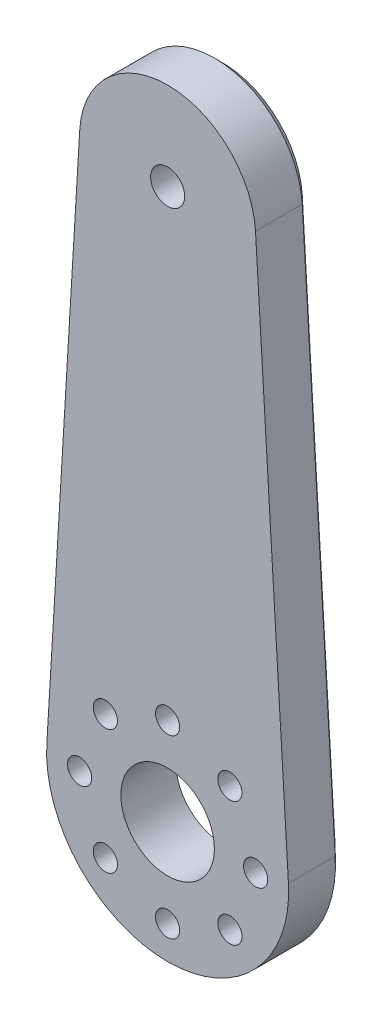
ISO-10303-21;
HEADER;
FILE_DESCRIPTION(('STEP AP214'),'2;1');
FILE_NAME('part.step','',(''),(''),'','','');
FILE_SCHEMA(('AUTOMOTIVE_DESIGN { 1 0 10303 214 1 1 1 1 }'));
ENDSEC;
DATA;
#1=APPLICATION_CONTEXT('core data for automotive mechanical design processes');
#2=APPLICATION_PROTOCOL_DEFINITION('international standard','automotive_design',2000,#1);
#3=PRODUCT_CONTEXT('',#1,'mechanical');
#4=PRODUCT('Part','Part','',(#3));
#5=PRODUCT_RELATED_PRODUCT_CATEGORY('part','',(#4));
#6=PRODUCT_DEFINITION_FORMATION('','',#4);
#7=PRODUCT_DEFINITION_CONTEXT('part definition',#1,'design');
#8=PRODUCT_DEFINITION('design','',#6,#7);
#9=PRODUCT_DEFINITION_SHAPE('','',#8);
#10=(LENGTH_UNIT() NAMED_UNIT(*) SI_UNIT(.MILLI.,.METRE.));
#11=(NAMED_UNIT(*) PLANE_ANGLE_UNIT() SI_UNIT($,.RADIAN.));
#12=(NAMED_UNIT(*) SI_UNIT($,.STERADIAN.) SOLID_ANGLE_UNIT());
#13=UNCERTAINTY_MEASURE_WITH_UNIT(LENGTH_MEASURE(1.E-05),#10,'distance_accuracy_value','');
#14=(GEOMETRIC_REPRESENTATION_CONTEXT(3) GLOBAL_UNCERTAINTY_ASSIGNED_CONTEXT((#13)) GLOBAL_UNIT_ASSIGNED_CONTEXT((#10,
#11,#12)) REPRESENTATION_CONTEXT('',''));
#15=CARTESIAN_POINT('',(0.,0.,0.));
#16=DIRECTION('',(0.,0.,1.));
#17=DIRECTION('',(1.,0.,0.));
#18=AXIS2_PLACEMENT_3D('',#15,#16,#17);
#19=CARTESIAN_POINT('',(-7.13829342442066,-19.0839036018759,5.));
#20=DIRECTION('',(0.,0.,-1.));
#21=DIRECTION('',(-1.,0.,0.));
#22=AXIS2_PLACEMENT_3D('',#19,#20,#21);
#23=CYLINDRICAL_SURFACE('',#22,1.1);
#24=CARTESIAN_POINT('',(-7.13829342442066,-19.0839036018759,5.));
#25=DIRECTION('',(0.,0.,1.));
#26=DIRECTION('',(1.,0.,0.));
#27=AXIS2_PLACEMENT_3D('',#24,#25,#26);
#28=CIRCLE('',#27,1.1);
#29=CARTESIAN_POINT('',(-6.03829342442066,-19.0839036018759,5.));
#30=VERTEX_POINT('',#29);
#31=EDGE_CURVE('E181',#30,#30,#28,.T.);
#32=ORIENTED_EDGE('',*,*,#31,.T.);
#33=EDGE_LOOP('',(#32));
#34=FACE_BOUND('',#33,.T.);
#35=CARTESIAN_POINT('',(-7.13829342442066,-19.0839036018759,2.25));
#36=DIRECTION('',(0.,0.,-1.));
#37=DIRECTION('',(-1.,0.,0.));
#38=AXIS2_PLACEMENT_3D('',#35,#36,#37);
#39=CIRCLE('',#38,1.1);
#40=CARTESIAN_POINT('',(-8.23829342442066,-19.0839036018759,2.25));
#41=VERTEX_POINT('',#40);
#42=EDGE_CURVE('E234',#41,#41,#39,.T.);
#43=ORIENTED_EDGE('',*,*,#42,.T.);
#44=EDGE_LOOP('',(#43));
#45=FACE_BOUND('',#44,.T.);
#46=ADVANCED_FACE('F35',(#34,#45),#23,.F.);
#47=CARTESIAN_POINT('',(-9.48143917492827,-24.7407578513683,5.));
#48=DIRECTION('',(0.,0.,-1.));
#49=DIRECTION('',(-1.,0.,0.));
#50=AXIS2_PLACEMENT_3D('',#47,#48,#49);
#51=CYLINDRICAL_SURFACE('',#50,1.1);
#52=CARTESIAN_POINT('',(-9.48143917492827,-24.7407578513683,5.));
#53=DIRECTION('',(0.,0.,1.));
#54=DIRECTION('',(1.,0.,0.));
#55=AXIS2_PLACEMENT_3D('',#52,#53,#54);
#56=CIRCLE('',#55,1.1);
#57=CARTESIAN_POINT('',(-8.38143917492827,-24.7407578513683,5.));
#58=VERTEX_POINT('',#57);
#59=EDGE_CURVE('E178',#58,#58,#56,.T.);
#60=ORIENTED_EDGE('',*,*,#59,.T.);
#61=EDGE_LOOP('',(#60));
#62=FACE_BOUND('',#61,.T.);
#63=CARTESIAN_POINT('',(-9.48143917492827,-24.7407578513683,2.25));
#64=DIRECTION('',(0.,0.,-1.));
#65=DIRECTION('',(-1.,0.,0.));
#66=AXIS2_PLACEMENT_3D('',#63,#64,#65);
#67=CIRCLE('',#66,1.1);
#68=CARTESIAN_POINT('',(-10.5814391749283,-24.7407578513683,2.25));
#69=VERTEX_POINT('',#68);
#70=EDGE_CURVE('E231',#69,#69,#67,.T.);
#71=ORIENTED_EDGE('',*,*,#70,.T.);
#72=EDGE_LOOP('',(#71));
#73=FACE_BOUND('',#72,.T.);
#74=ADVANCED_FACE('F332',(#62,#73),#51,.F.);
#75=CARTESIAN_POINT('',(-15.1382934244207,-27.0839036018759,5.));
#76=DIRECTION('',(0.,0.,-1.));
#77=DIRECTION('',(-1.,0.,0.));
#78=AXIS2_PLACEMENT_3D('',#75,#76,#77);
#79=CYLINDRICAL_SURFACE('',#78,1.1);
#80=CARTESIAN_POINT('',(-15.1382934244207,-27.0839036018759,5.));
#81=DIRECTION('',(0.,0.,1.));
#82=DIRECTION('',(1.,0.,0.));
#83=AXIS2_PLACEMENT_3D('',#80,#81,#82);
#84=CIRCLE('',#83,1.1);
#85=CARTESIAN_POINT('',(-14.0382934244207,-27.0839036018759,5.));
#86=VERTEX_POINT('',#85);
#87=EDGE_CURVE('E175',#86,#86,#84,.T.);
#88=ORIENTED_EDGE('',*,*,#87,.T.);
#89=EDGE_LOOP('',(#88));
#90=FACE_BOUND('',#89,.T.);
#91=CARTESIAN_POINT('',(-15.1382934244207,-27.0839036018759,2.25));
#92=DIRECTION('',(0.,0.,-1.));
#93=DIRECTION('',(-1.,0.,0.));
#94=AXIS2_PLACEMENT_3D('',#91,#92,#93);
#95=CIRCLE('',#94,1.1);
#96=CARTESIAN_POINT('',(-16.2382934244207,-27.0839036018759,2.25));
#97=VERTEX_POINT('',#96);
#98=EDGE_CURVE('E228',#97,#97,#95,.T.);
#99=ORIENTED_EDGE('',*,*,#98,.T.);
#100=EDGE_LOOP('',(#99));
#101=FACE_BOUND('',#100,.T.);
#102=ADVANCED_FACE('F338',(#90,#101),#79,.F.);
#103=CARTESIAN_POINT('',(-20.795147673913,-24.7407578513683,5.));
#104=DIRECTION('',(0.,0.,-1.));
#105=DIRECTION('',(-1.,0.,0.));
#106=AXIS2_PLACEMENT_3D('',#103,#104,#105);
#107=CYLINDRICAL_SURFACE('',#106,1.1);
#108=CARTESIAN_POINT('',(-20.795147673913,-24.7407578513683,5.));
#109=DIRECTION('',(0.,0.,1.));
#110=DIRECTION('',(1.,0.,0.));
#111=AXIS2_PLACEMENT_3D('',#108,#109,#110);
#112=CIRCLE('',#111,1.1);
#113=CARTESIAN_POINT('',(-19.695147673913,-24.7407578513683,5.));
#114=VERTEX_POINT('',#113);
#115=EDGE_CURVE('E172',#114,#114,#112,.T.);
#116=ORIENTED_EDGE('',*,*,#115,.T.);
#117=EDGE_LOOP('',(#116));
#118=FACE_BOUND('',#117,.T.);
#119=CARTESIAN_POINT('',(-20.795147673913,-24.7407578513683,2.25));
#120=DIRECTION('',(0.,0.,-1.));
#121=DIRECTION('',(-1.,0.,0.));
#122=AXIS2_PLACEMENT_3D('',#119,#120,#121);
#123=CIRCLE('',#122,1.1);
#124=CARTESIAN_POINT('',(-21.895147673913,-24.7407578513683,2.25));
#125=VERTEX_POINT('',#124);
#126=EDGE_CURVE('E225',#125,#125,#123,.T.);
#127=ORIENTED_EDGE('',*,*,#126,.T.);
#128=EDGE_LOOP('',(#127));
#129=FACE_BOUND('',#128,.T.);
#130=ADVANCED_FACE('F724',(#118,#129),#107,.F.);
#131=CARTESIAN_POINT('',(-23.1382934244207,-19.0839036018759,5.));
#132=DIRECTION('',(0.,0.,-1.));
#133=DIRECTION('',(-1.,0.,0.));
#134=AXIS2_PLACEMENT_3D('',#131,#132,#133);
#135=CYLINDRICAL_SURFACE('',#134,1.1);
#136=CARTESIAN_POINT('',(-23.1382934244207,-19.0839036018759,5.));
#137=DIRECTION('',(0.,0.,1.));
#138=DIRECTION('',(1.,0.,0.));
#139=AXIS2_PLACEMENT_3D('',#136,#137,#138);
#140=CIRCLE('',#139,1.1);
#141=CARTESIAN_POINT('',(-22.0382934244207,-19.0839036018759,5.));
#142=VERTEX_POINT('',#141);
#143=EDGE_CURVE('E169',#142,#142,#140,.T.);
#144=ORIENTED_EDGE('',*,*,#143,.T.);
#145=EDGE_LOOP('',(#144));
#146=FACE_BOUND('',#145,.T.);
#147=CARTESIAN_POINT('',(-23.1382934244207,-19.0839036018759,2.25));
#148=DIRECTION('',(0.,0.,-1.));
#149=DIRECTION('',(-1.,0.,0.));
#150=AXIS2_PLACEMENT_3D('',#147,#148,#149);
#151=CIRCLE('',#150,1.1);
#152=CARTESIAN_POINT('',(-24.2382934244207,-19.0839036018759,2.25));
#153=VERTEX_POINT('',#152);
#154=EDGE_CURVE('E222',#153,#153,#151,.T.);
#155=ORIENTED_EDGE('',*,*,#154,.T.);
#156=EDGE_LOOP('',(#155));
#157=FACE_BOUND('',#156,.T.);
#158=ADVANCED_FACE('F733',(#146,#157),#135,.F.);
#159=CARTESIAN_POINT('',(-20.795147673913,-13.4270493523836,5.));
#160=DIRECTION('',(0.,0.,-1.));
#161=DIRECTION('',(-1.,0.,0.));
#162=AXIS2_PLACEMENT_3D('',#159,#160,#161);
#163=CYLINDRICAL_SURFACE('',#162,1.1);
#164=CARTESIAN_POINT('',(-20.795147673913,-13.4270493523836,5.));
#165=DIRECTION('',(0.,0.,1.));
#166=DIRECTION('',(1.,0.,0.));
#167=AXIS2_PLACEMENT_3D('',#164,#165,#166);
#168=CIRCLE('',#167,1.1);
#169=CARTESIAN_POINT('',(-19.695147673913,-13.4270493523836,5.));
#170=VERTEX_POINT('',#169);
#171=EDGE_CURVE('E166',#170,#170,#168,.T.);
#172=ORIENTED_EDGE('',*,*,#171,.T.);
#173=EDGE_LOOP('',(#172));
#174=FACE_BOUND('',#173,.T.);
#175=CARTESIAN_POINT('',(-20.795147673913,-13.4270493523836,2.25));
#176=DIRECTION('',(0.,0.,-1.));
#177=DIRECTION('',(-1.,0.,0.));
#178=AXIS2_PLACEMENT_3D('',#175,#176,#177);
#179=CIRCLE('',#178,1.1);
#180=CARTESIAN_POINT('',(-21.895147673913,-13.4270493523836,2.25));
#181=VERTEX_POINT('',#180);
#182=EDGE_CURVE('E219',#181,#181,#179,.T.);
#183=ORIENTED_EDGE('',*,*,#182,.T.);
#184=EDGE_LOOP('',(#183));
#185=FACE_BOUND('',#184,.T.);
#186=ADVANCED_FACE('F743',(#174,#185),#163,.F.);
#187=CARTESIAN_POINT('',(-15.1382934244207,-11.0839036018759,5.));
#188=DIRECTION('',(0.,0.,-1.));
#189=DIRECTION('',(-1.,0.,0.));
#190=AXIS2_PLACEMENT_3D('',#187,#188,#189);
#191=CYLINDRICAL_SURFACE('',#190,1.1);
#192=CARTESIAN_POINT('',(-15.1382934244207,-11.0839036018759,5.));
#193=DIRECTION('',(0.,0.,1.));
#194=DIRECTION('',(1.,0.,0.));
#195=AXIS2_PLACEMENT_3D('',#192,#193,#194);
#196=CIRCLE('',#195,1.1);
#197=CARTESIAN_POINT('',(-14.0382934244207,-11.0839036018759,5.));
#198=VERTEX_POINT('',#197);
#199=EDGE_CURVE('E163',#198,#198,#196,.T.);
#200=ORIENTED_EDGE('',*,*,#199,.T.);
#201=EDGE_LOOP('',(#200));
#202=FACE_BOUND('',#201,.T.);
#203=CARTESIAN_POINT('',(-15.1382934244207,-11.0839036018759,2.25));
#204=DIRECTION('',(0.,0.,-1.));
#205=DIRECTION('',(-1.,0.,0.));
#206=AXIS2_PLACEMENT_3D('',#203,#204,#205);
#207=CIRCLE('',#206,1.1);
#208=CARTESIAN_POINT('',(-16.2382934244207,-11.0839036018759,2.25));
#209=VERTEX_POINT('',#208);
#210=EDGE_CURVE('E215',#209,#209,#207,.T.);
#211=ORIENTED_EDGE('',*,*,#210,.T.);
#212=EDGE_LOOP('',(#211));
#213=FACE_BOUND('',#212,.T.);
#214=ADVANCED_FACE('F418',(#202,#213),#191,.F.);
#215=CARTESIAN_POINT('',(-9.48143917492829,-13.4270493523836,5.));
#216=DIRECTION('',(0.,0.,-1.));
#217=DIRECTION('',(-1.,0.,0.));
#218=AXIS2_PLACEMENT_3D('',#215,#216,#217);
#219=CYLINDRICAL_SURFACE('',#218,1.1);
#220=CARTESIAN_POINT('',(-9.48143917492829,-13.4270493523836,5.));
#221=DIRECTION('',(0.,0.,1.));
#222=DIRECTION('',(1.,0.,0.));
#223=AXIS2_PLACEMENT_3D('',#220,#221,#222);
#224=CIRCLE('',#223,1.1);
#225=CARTESIAN_POINT('',(-8.38143917492829,-13.4270493523836,5.));
#226=VERTEX_POINT('',#225);
#227=EDGE_CURVE('E155',#226,#226,#224,.T.);
#228=ORIENTED_EDGE('',*,*,#227,.T.);
#229=EDGE_LOOP('',(#228));
#230=FACE_BOUND('',#229,.T.);
#231=CARTESIAN_POINT('',(-9.48143917492829,-13.4270493523836,2.25));
#232=DIRECTION('',(0.,0.,-1.));
#233=DIRECTION('',(-1.,0.,0.));
#234=AXIS2_PLACEMENT_3D('',#231,#232,#233);
#235=CIRCLE('',#234,1.1);
#236=CARTESIAN_POINT('',(-10.5814391749283,-13.4270493523836,2.25));
#237=VERTEX_POINT('',#236);
#238=EDGE_CURVE('E212',#237,#237,#235,.T.);
#239=ORIENTED_EDGE('',*,*,#238,.T.);
#240=EDGE_LOOP('',(#239));
#241=FACE_BOUND('',#240,.T.);
#242=ADVANCED_FACE('F360',(#230,#241),#219,.F.);
#243=CARTESIAN_POINT('',(-15.1382934244207,30.9160963981241,0.));
#244=DIRECTION('',(0.,0.,1.));
#245=DIRECTION('',(1.,0.,0.));
#246=AXIS2_PLACEMENT_3D('',#243,#244,#245);
#247=PLANE('',#246);
#248=CARTESIAN_POINT('',(-15.1382934244207,-19.0839036018759,0.));
#249=DIRECTION('',(0.,0.,1.));
#250=DIRECTION('',(1.,0.,0.));
#251=AXIS2_PLACEMENT_3D('',#248,#249,#250);
#252=CIRCLE('',#251,10.25);
#253=CARTESIAN_POINT('',(-4.90676005937707,-18.4689036018759,0.));
#254=VERTEX_POINT('',#253);
#255=CARTESIAN_POINT('',(-25.3698267894642,-18.4689036018759,0.));
#256=VERTEX_POINT('',#255);
#257=EDGE_CURVE('E244',#254,#256,#252,.F.);
#258=ORIENTED_EDGE('',*,*,#257,.T.);
#259=DIRECTION('',(0.0599999999999999,0.998198377077423,0.));
#260=VECTOR('',#259,1.);
#261=CARTESIAN_POINT('',(-22.375231658232,31.3510963981241,0.));
#262=LINE('',#261,#260);
#263=CARTESIAN_POINT('',(-22.375231658232,31.3510963981241,0.));
#264=VERTEX_POINT('',#263);
#265=EDGE_CURVE('E246',#256,#264,#262,.T.);
#266=ORIENTED_EDGE('',*,*,#265,.T.);
#267=CARTESIAN_POINT('',(-15.1382934244207,30.9160963981241,0.));
#268=DIRECTION('',(0.,0.,1.));
#269=DIRECTION('',(1.,0.,0.));
#270=AXIS2_PLACEMENT_3D('',#267,#268,#269);
#271=CIRCLE('',#270,7.25000000000001);
#272=CARTESIAN_POINT('',(-7.90135519060934,31.3510963981241,0.));
#273=VERTEX_POINT('',#272);
#274=EDGE_CURVE('E242',#264,#273,#271,.F.);
#275=ORIENTED_EDGE('',*,*,#274,.T.);
#276=DIRECTION('',(0.06,-0.998198377077423,0.));
#277=VECTOR('',#276,1.);
#278=CARTESIAN_POINT('',(-7.90135519060934,31.3510963981241,0.));
#279=LINE('',#278,#277);
#280=EDGE_CURVE('E240',#273,#254,#279,.T.);
#281=ORIENTED_EDGE('',*,*,#280,.T.);
#282=EDGE_LOOP('',(#258,#266,#275,#281));
#283=FACE_BOUND('',#282,.T.);
#284=CARTESIAN_POINT('',(-20.795147673913,-13.4270493523836,0.));
#285=DIRECTION('',(0.,0.,-1.));
#286=DIRECTION('',(-1.,0.,0.));
#287=AXIS2_PLACEMENT_3D('',#284,#285,#286);
#288=CIRCLE('',#287,1.75);
#289=CARTESIAN_POINT('',(-22.545147673913,-13.4270493523836,0.));
#290=VERTEX_POINT('',#289);
#291=EDGE_CURVE('E260',#290,#290,#288,.T.);
#292=ORIENTED_EDGE('',*,*,#291,.F.);
#293=EDGE_LOOP('',(#292));
#294=FACE_BOUND('',#293,.T.);
#295=CARTESIAN_POINT('',(-15.1382934244207,-11.0839036018759,0.));
#296=DIRECTION('',(0.,0.,-1.));
#297=DIRECTION('',(-1.,0.,0.));
#298=AXIS2_PLACEMENT_3D('',#295,#296,#297);
#299=CIRCLE('',#298,1.75);
#300=CARTESIAN_POINT('',(-16.8882934244207,-11.0839036018759,0.));
#301=VERTEX_POINT('',#300);
#302=EDGE_CURVE('E271',#301,#301,#299,.T.);
#303=ORIENTED_EDGE('',*,*,#302,.F.);
#304=EDGE_LOOP('',(#303));
#305=FACE_BOUND('',#304,.T.);
#306=CARTESIAN_POINT('',(-9.48143917492828,-13.4270493523836,0.));
#307=DIRECTION('',(0.,0.,-1.));
#308=DIRECTION('',(-1.,0.,0.));
#309=AXIS2_PLACEMENT_3D('',#306,#307,#308);
#310=CIRCLE('',#309,1.75);
#311=CARTESIAN_POINT('',(-11.2314391749283,-13.4270493523836,0.));
#312=VERTEX_POINT('',#311);
#313=EDGE_CURVE('E433',#312,#312,#310,.T.);
#314=ORIENTED_EDGE('',*,*,#313,.F.);
#315=EDGE_LOOP('',(#314));
#316=FACE_BOUND('',#315,.T.);
#317=CARTESIAN_POINT('',(-7.13829342442066,-19.0839036018759,0.));
#318=DIRECTION('',(0.,0.,-1.));
#319=DIRECTION('',(-1.,0.,0.));
#320=AXIS2_PLACEMENT_3D('',#317,#318,#319);
#321=CIRCLE('',#320,1.75);
#322=CARTESIAN_POINT('',(-8.88829342442066,-19.0839036018759,0.));
#323=VERTEX_POINT('',#322);
#324=EDGE_CURVE('E432',#323,#323,#321,.T.);
#325=ORIENTED_EDGE('',*,*,#324,.F.);
#326=EDGE_LOOP('',(#325));
#327=FACE_BOUND('',#326,.T.);
#328=CARTESIAN_POINT('',(-9.48143917492829,-24.7407578513683,0.));
#329=DIRECTION('',(0.,0.,-1.));
#330=DIRECTION('',(-1.,0.,0.));
#331=AXIS2_PLACEMENT_3D('',#328,#329,#330);
#332=CIRCLE('',#331,1.75);
#333=CARTESIAN_POINT('',(-11.2314391749283,-24.7407578513683,0.));
#334=VERTEX_POINT('',#333);
#335=EDGE_CURVE('E456',#334,#334,#332,.T.);
#336=ORIENTED_EDGE('',*,*,#335,.F.);
#337=EDGE_LOOP('',(#336));
#338=FACE_BOUND('',#337,.T.);
#339=CARTESIAN_POINT('',(-15.1382934244207,-27.0839036018759,0.));
#340=DIRECTION('',(0.,0.,-1.));
#341=DIRECTION('',(-1.,0.,0.));
#342=AXIS2_PLACEMENT_3D('',#339,#340,#341);
#343=CIRCLE('',#342,1.75);
#344=CARTESIAN_POINT('',(-16.8882934244207,-27.0839036018759,0.));
#345=VERTEX_POINT('',#344);
#346=EDGE_CURVE('E460',#345,#345,#343,.T.);
#347=ORIENTED_EDGE('',*,*,#346,.F.);
#348=EDGE_LOOP('',(#347));
#349=FACE_BOUND('',#348,.T.);
#350=CARTESIAN_POINT('',(-20.795147673913,-24.7407578513683,0.));
#351=DIRECTION('',(0.,0.,-1.));
#352=DIRECTION('',(-1.,0.,0.));
#353=AXIS2_PLACEMENT_3D('',#350,#351,#352);
#354=CIRCLE('',#353,1.74999999999999);
#355=CARTESIAN_POINT('',(-22.545147673913,-24.7407578513683,0.));
#356=VERTEX_POINT('',#355);
#357=EDGE_CURVE('E464',#356,#356,#354,.T.);
#358=ORIENTED_EDGE('',*,*,#357,.F.);
#359=EDGE_LOOP('',(#358));
#360=FACE_BOUND('',#359,.T.);
#361=CARTESIAN_POINT('',(-23.1382934244207,-19.0839036018759,0.));
#362=DIRECTION('',(0.,0.,-1.));
#363=DIRECTION('',(-1.,0.,0.));
#364=AXIS2_PLACEMENT_3D('',#361,#362,#363);
#365=CIRCLE('',#364,1.75);
#366=CARTESIAN_POINT('',(-24.8882934244207,-19.0839036018759,0.));
#367=VERTEX_POINT('',#366);
#368=EDGE_CURVE('E277',#367,#367,#365,.T.);
#369=ORIENTED_EDGE('',*,*,#368,.F.);
#370=EDGE_LOOP('',(#369));
#371=FACE_BOUND('',#370,.T.);
#372=CARTESIAN_POINT('',(-15.1382934244207,-19.0839036018759,0.));
#373=DIRECTION('',(0.,0.,1.));
#374=DIRECTION('',(1.,0.,0.));
#375=AXIS2_PLACEMENT_3D('',#372,#373,#374);
#376=CIRCLE('',#375,4.25);
#377=CARTESIAN_POINT('',(-10.8882934244207,-19.0839036018759,0.));
#378=VERTEX_POINT('',#377);
#379=EDGE_CURVE('E184',#378,#378,#376,.T.);
#380=ORIENTED_EDGE('',*,*,#379,.T.);
#381=EDGE_LOOP('',(#380));
#382=FACE_BOUND('',#381,.T.);
#383=DIRECTION('',(1.,0.,0.));
#384=VECTOR('',#383,1.);
#385=CARTESIAN_POINT('',(-16.7260066646921,28.1660963981241,0.));
#386=LINE('',#385,#384);
#387=CARTESIAN_POINT('',(-16.7260066646921,28.1660963981241,0.));
#388=VERTEX_POINT('',#387);
#389=CARTESIAN_POINT('',(-13.5505801841492,28.1660963981241,0.));
#390=VERTEX_POINT('',#389);
#391=EDGE_CURVE('E237',#388,#390,#386,.T.);
#392=ORIENTED_EDGE('',*,*,#391,.T.);
#393=DIRECTION('',(0.5,0.866025403784439,0.));
#394=VECTOR('',#393,1.);
#395=CARTESIAN_POINT('',(-13.5505801841492,28.1660963981241,0.));
#396=LINE('',#395,#394);
#397=CARTESIAN_POINT('',(-11.9628669438777,30.9160963981241,0.));
#398=VERTEX_POINT('',#397);
#399=EDGE_CURVE('E150',#390,#398,#396,.T.);
#400=ORIENTED_EDGE('',*,*,#399,.T.);
#401=DIRECTION('',(-0.499999999999999,0.866025403784439,0.));
#402=VECTOR('',#401,1.);
#403=CARTESIAN_POINT('',(-11.9628669438777,30.9160963981241,0.));
#404=LINE('',#403,#402);
#405=CARTESIAN_POINT('',(-13.5505801841492,33.6660963981241,0.));
#406=VERTEX_POINT('',#405);
#407=EDGE_CURVE('E290',#398,#406,#404,.T.);
#408=ORIENTED_EDGE('',*,*,#407,.T.);
#409=DIRECTION('',(-1.,0.,0.));
#410=VECTOR('',#409,1.);
#411=CARTESIAN_POINT('',(-13.5505801841492,33.6660963981241,0.));
#412=LINE('',#411,#410);
#413=CARTESIAN_POINT('',(-16.7260066646921,33.6660963981241,0.));
#414=VERTEX_POINT('',#413);
#415=EDGE_CURVE('E293',#406,#414,#412,.T.);
#416=ORIENTED_EDGE('',*,*,#415,.T.);
#417=DIRECTION('',(-0.5,-0.866025403784439,0.));
#418=VECTOR('',#417,1.);
#419=CARTESIAN_POINT('',(-16.7260066646921,33.6660963981241,0.));
#420=LINE('',#419,#418);
#421=CARTESIAN_POINT('',(-18.3137199049636,30.9160963981241,0.));
#422=VERTEX_POINT('',#421);
#423=EDGE_CURVE('E296',#414,#422,#420,.T.);
#424=ORIENTED_EDGE('',*,*,#423,.T.);
#425=DIRECTION('',(0.5,-0.866025403784439,0.));
#426=VECTOR('',#425,1.);
#427=CARTESIAN_POINT('',(-18.3137199049636,30.9160963981241,0.));
#428=LINE('',#427,#426);
#429=EDGE_CURVE('E146',#422,#388,#428,.T.);
#430=ORIENTED_EDGE('',*,*,#429,.T.);
#431=EDGE_LOOP('',(#392,#400,#408,#416,#424,#430));
#432=FACE_BOUND('',#431,.T.);
#433=ADVANCED_FACE('F315',(#283,#294,#305,#316,#327,#338,#349,#360,#371,#382,#432),#247,.F.);
#434=CARTESIAN_POINT('',(-15.1382934244207,30.9160963981241,5.));
#435=DIRECTION('',(0.,0.,1.));
#436=DIRECTION('',(1.,0.,0.));
#437=AXIS2_PLACEMENT_3D('',#434,#435,#436);
#438=PLANE('',#437);
#439=ORIENTED_EDGE('',*,*,#199,.F.);
#440=EDGE_LOOP('',(#439));
#441=FACE_BOUND('',#440,.T.);
#442=ORIENTED_EDGE('',*,*,#143,.F.);
#443=EDGE_LOOP('',(#442));
#444=FACE_BOUND('',#443,.T.);
#445=ORIENTED_EDGE('',*,*,#87,.F.);
#446=EDGE_LOOP('',(#445));
#447=FACE_BOUND('',#446,.T.);
#448=ORIENTED_EDGE('',*,*,#31,.F.);
#449=EDGE_LOOP('',(#448));
#450=FACE_BOUND('',#449,.T.);
#451=CARTESIAN_POINT('',(-15.1382934244207,30.9160963981241,5.));
#452=DIRECTION('',(0.,0.,1.));
#453=DIRECTION('',(1.,0.,0.));
#454=AXIS2_PLACEMENT_3D('',#451,#452,#453);
#455=CIRCLE('',#454,1.55);
#456=CARTESIAN_POINT('',(-13.5882934244207,30.9160963981241,5.));
#457=VERTEX_POINT('',#456);
#458=EDGE_CURVE('E188',#457,#457,#455,.T.);
#459=ORIENTED_EDGE('',*,*,#458,.F.);
#460=EDGE_LOOP('',(#459));
#461=FACE_BOUND('',#460,.T.);
#462=CARTESIAN_POINT('',(-15.1382934244207,30.9160963981241,5.));
#463=DIRECTION('',(0.,0.,1.));
#464=DIRECTION('',(1.,0.,0.));
#465=AXIS2_PLACEMENT_3D('',#462,#463,#464);
#466=CIRCLE('',#465,8.);
#467=CARTESIAN_POINT('',(-7.15270640780128,31.3960963981241,5.));
#468=VERTEX_POINT('',#467);
#469=CARTESIAN_POINT('',(-23.12388044104,31.3960963981241,5.));
#470=VERTEX_POINT('',#469);
#471=EDGE_CURVE('E193',#468,#470,#466,.T.);
#472=ORIENTED_EDGE('',*,*,#471,.T.);
#473=DIRECTION('',(-0.0599999999999999,-0.998198377077422,0.));
#474=VECTOR('',#473,1.);
#475=CARTESIAN_POINT('',(-23.12388044104,31.3960963981241,5.));
#476=LINE('',#475,#474);
#477=CARTESIAN_POINT('',(-26.1184755722723,-18.4239036018759,5.));
#478=VERTEX_POINT('',#477);
#479=EDGE_CURVE('E196',#470,#478,#476,.T.);
#480=ORIENTED_EDGE('',*,*,#479,.T.);
#481=CARTESIAN_POINT('',(-15.1382934244207,-19.0839036018759,5.));
#482=DIRECTION('',(0.,0.,1.));
#483=DIRECTION('',(1.,0.,0.));
#484=AXIS2_PLACEMENT_3D('',#481,#482,#483);
#485=CIRCLE('',#484,11.);
#486=CARTESIAN_POINT('',(-4.15811127656901,-18.4239036018759,5.));
#487=VERTEX_POINT('',#486);
#488=EDGE_CURVE('E198',#478,#487,#485,.T.);
#489=ORIENTED_EDGE('',*,*,#488,.T.);
#490=DIRECTION('',(-0.06,0.998198377077422,0.));
#491=VECTOR('',#490,1.);
#492=CARTESIAN_POINT('',(-7.15270640780128,31.3960963981241,5.));
#493=LINE('',#492,#491);
#494=EDGE_CURVE('E200',#487,#468,#493,.T.);
#495=ORIENTED_EDGE('',*,*,#494,.T.);
#496=EDGE_LOOP('',(#472,#480,#489,#495));
#497=FACE_BOUND('',#496,.T.);
#498=CARTESIAN_POINT('',(-15.1382934244207,-19.0839036018759,5.));
#499=DIRECTION('',(0.,0.,1.));
#500=DIRECTION('',(1.,0.,0.));
#501=AXIS2_PLACEMENT_3D('',#498,#499,#500);
#502=CIRCLE('',#501,4.25);
#503=CARTESIAN_POINT('',(-10.8882934244207,-19.0839036018759,5.));
#504=VERTEX_POINT('',#503);
#505=EDGE_CURVE('E185',#504,#504,#502,.T.);
#506=ORIENTED_EDGE('',*,*,#505,.F.);
#507=EDGE_LOOP('',(#506));
#508=FACE_BOUND('',#507,.T.);
#509=ORIENTED_EDGE('',*,*,#59,.F.);
#510=EDGE_LOOP('',(#509));
#511=FACE_BOUND('',#510,.T.);
#512=ORIENTED_EDGE('',*,*,#115,.F.);
#513=EDGE_LOOP('',(#512));
#514=FACE_BOUND('',#513,.T.);
#515=ORIENTED_EDGE('',*,*,#171,.F.);
#516=EDGE_LOOP('',(#515));
#517=FACE_BOUND('',#516,.T.);
#518=ORIENTED_EDGE('',*,*,#227,.F.);
#519=EDGE_LOOP('',(#518));
#520=FACE_BOUND('',#519,.T.);
#521=ADVANCED_FACE('F353',(#441,#444,#447,#450,#461,#497,#508,#511,#514,#517,#520),#438,.T.);
#522=CARTESIAN_POINT('',(-15.1382934244207,30.9160963981241,5.));
#523=DIRECTION('',(0.,0.,-1.));
#524=DIRECTION('',(-1.,0.,0.));
#525=AXIS2_PLACEMENT_3D('',#522,#523,#524);
#526=CYLINDRICAL_SURFACE('',#525,8.);
#527=DIRECTION('',(0.,0.,-1.));
#528=VECTOR('',#527,1.);
#529=CARTESIAN_POINT('',(-7.15270640780128,31.3960963981241,5.));
#530=LINE('',#529,#528);
#531=CARTESIAN_POINT('',(-7.15270640780128,31.3960963981241,0.749999999999987));
#532=VERTEX_POINT('',#531);
#533=EDGE_CURVE('E202',#468,#532,#530,.T.);
#534=ORIENTED_EDGE('',*,*,#533,.T.);
#535=CARTESIAN_POINT('',(-15.1382934244207,30.9160963981241,0.749999999999987));
#536=DIRECTION('',(0.,0.,1.));
#537=DIRECTION('',(1.,0.,0.));
#538=AXIS2_PLACEMENT_3D('',#535,#536,#537);
#539=CIRCLE('',#538,8.);
#540=CARTESIAN_POINT('',(-23.12388044104,31.3960963981241,0.749999999999987));
#541=VERTEX_POINT('',#540);
#542=EDGE_CURVE('E44',#532,#541,#539,.T.);
#543=ORIENTED_EDGE('',*,*,#542,.T.);
#544=DIRECTION('',(0.,0.,-1.));
#545=VECTOR('',#544,1.);
#546=CARTESIAN_POINT('',(-23.12388044104,31.3960963981241,5.));
#547=LINE('',#546,#545);
#548=EDGE_CURVE('E208',#470,#541,#547,.T.);
#549=ORIENTED_EDGE('',*,*,#548,.F.);
#550=ORIENTED_EDGE('',*,*,#471,.F.);
#551=EDGE_LOOP('',(#534,#543,#549,#550));
#552=FACE_BOUND('',#551,.T.);
#553=ADVANCED_FACE('F356',(#552),#526,.T.);
#554=CARTESIAN_POINT('',(-23.12388044104,31.3960963981241,5.));
#555=DIRECTION('',(0.998198377077422,-0.0599999999999999,0.));
#556=DIRECTION('',(0.0599999999999999,0.998198377077422,0.));
#557=AXIS2_PLACEMENT_3D('',#554,#555,#556);
#558=PLANE('',#557);
#559=ORIENTED_EDGE('',*,*,#548,.T.);
#560=DIRECTION('',(-0.0599999999999999,-0.998198377077422,0.));
#561=VECTOR('',#560,1.);
#562=CARTESIAN_POINT('',(-23.12388044104,31.3960963981241,0.749999999999987));
#563=LINE('',#562,#561);
#564=CARTESIAN_POINT('',(-26.1184755722723,-18.4239036018759,0.749999999999987));
#565=VERTEX_POINT('',#564);
#566=EDGE_CURVE('E210',#541,#565,#563,.T.);
#567=ORIENTED_EDGE('',*,*,#566,.T.);
#568=DIRECTION('',(0.,0.,-1.));
#569=VECTOR('',#568,1.);
#570=CARTESIAN_POINT('',(-26.1184755722723,-18.4239036018759,5.));
#571=LINE('',#570,#569);
#572=EDGE_CURVE('E206',#478,#565,#571,.T.);
#573=ORIENTED_EDGE('',*,*,#572,.F.);
#574=ORIENTED_EDGE('',*,*,#479,.F.);
#575=EDGE_LOOP('',(#559,#567,#573,#574));
#576=FACE_BOUND('',#575,.T.);
#577=ADVANCED_FACE('F367',(#576),#558,.F.);
#578=CARTESIAN_POINT('',(-15.1382934244207,-19.0839036018759,5.));
#579=DIRECTION('',(0.,0.,-1.));
#580=DIRECTION('',(-1.,0.,0.));
#581=AXIS2_PLACEMENT_3D('',#578,#579,#580);
#582=CYLINDRICAL_SURFACE('',#581,11.);
#583=ORIENTED_EDGE('',*,*,#572,.T.);
#584=CARTESIAN_POINT('',(-15.1382934244207,-19.0839036018759,0.749999999999987));
#585=DIRECTION('',(0.,0.,1.));
#586=DIRECTION('',(1.,0.,0.));
#587=AXIS2_PLACEMENT_3D('',#584,#585,#586);
#588=CIRCLE('',#587,11.);
#589=CARTESIAN_POINT('',(-4.15811127656901,-18.4239036018759,0.749999999999987));
#590=VERTEX_POINT('',#589);
#591=EDGE_CURVE('E58',#565,#590,#588,.T.);
#592=ORIENTED_EDGE('',*,*,#591,.T.);
#593=DIRECTION('',(0.,0.,-1.));
#594=VECTOR('',#593,1.);
#595=CARTESIAN_POINT('',(-4.15811127656901,-18.4239036018759,5.));
#596=LINE('',#595,#594);
#597=EDGE_CURVE('E204',#487,#590,#596,.T.);
#598=ORIENTED_EDGE('',*,*,#597,.F.);
#599=ORIENTED_EDGE('',*,*,#488,.F.);
#600=EDGE_LOOP('',(#583,#592,#598,#599));
#601=FACE_BOUND('',#600,.T.);
#602=ADVANCED_FACE('F364',(#601),#582,.T.);
#603=CARTESIAN_POINT('',(-7.15270640780128,31.3960963981241,5.));
#604=DIRECTION('',(-0.998198377077422,-0.06,0.));
#605=DIRECTION('',(0.06,-0.998198377077422,0.));
#606=AXIS2_PLACEMENT_3D('',#603,#604,#605);
#607=PLANE('',#606);
#608=ORIENTED_EDGE('',*,*,#597,.T.);
#609=DIRECTION('',(-0.06,0.998198377077422,0.));
#610=VECTOR('',#609,1.);
#611=CARTESIAN_POINT('',(-7.15270640780128,31.3960963981241,0.749999999999987));
#612=LINE('',#611,#610);
#613=EDGE_CURVE('E11',#590,#532,#612,.T.);
#614=ORIENTED_EDGE('',*,*,#613,.T.);
#615=ORIENTED_EDGE('',*,*,#533,.F.);
#616=ORIENTED_EDGE('',*,*,#494,.F.);
#617=EDGE_LOOP('',(#608,#614,#615,#616));
#618=FACE_BOUND('',#617,.T.);
#619=ADVANCED_FACE('F351',(#618),#607,.F.);
#620=CARTESIAN_POINT('',(-15.1382934244207,30.9160963981241,5.));
#621=DIRECTION('',(0.,0.,-1.));
#622=DIRECTION('',(-1.,0.,0.));
#623=AXIS2_PLACEMENT_3D('',#620,#621,#622);
#624=CYLINDRICAL_SURFACE('',#623,1.55);
#625=CARTESIAN_POINT('',(-15.1382934244207,30.9160963981241,2.));
#626=DIRECTION('',(0.,0.,1.));
#627=DIRECTION('',(1.,0.,0.));
#628=AXIS2_PLACEMENT_3D('',#625,#626,#627);
#629=CIRCLE('',#628,1.55);
#630=CARTESIAN_POINT('',(-13.5882934244207,30.9160963981241,2.));
#631=VERTEX_POINT('',#630);
#632=EDGE_CURVE('E151',#631,#631,#629,.T.);
#633=ORIENTED_EDGE('',*,*,#632,.F.);
#634=EDGE_LOOP('',(#633));
#635=FACE_BOUND('',#634,.T.);
#636=ORIENTED_EDGE('',*,*,#458,.T.);
#637=EDGE_LOOP('',(#636));
#638=FACE_BOUND('',#637,.T.);
#639=ADVANCED_FACE('F347',(#635,#638),#624,.F.);
#640=CARTESIAN_POINT('',(-15.1382934244207,-19.0839036018759,5.));
#641=DIRECTION('',(0.,0.,-1.));
#642=DIRECTION('',(-1.,0.,0.));
#643=AXIS2_PLACEMENT_3D('',#640,#641,#642);
#644=CYLINDRICAL_SURFACE('',#643,4.25);
#645=ORIENTED_EDGE('',*,*,#505,.T.);
#646=EDGE_LOOP('',(#645));
#647=FACE_BOUND('',#646,.T.);
#648=ORIENTED_EDGE('',*,*,#379,.F.);
#649=EDGE_LOOP('',(#648));
#650=FACE_BOUND('',#649,.T.);
#651=ADVANCED_FACE('F344',(#647,#650),#644,.F.);
#652=CARTESIAN_POINT('',(-16.7260066646921,28.1660963981241,2.));
#653=DIRECTION('',(0.,1.,0.));
#654=DIRECTION('',(0.,0.,1.));
#655=AXIS2_PLACEMENT_3D('',#652,#653,#654);
#656=PLANE('',#655);
#657=ORIENTED_EDGE('',*,*,#391,.F.);
#658=DIRECTION('',(0.,0.,-1.));
#659=VECTOR('',#658,1.);
#660=CARTESIAN_POINT('',(-16.7260066646921,28.1660963981241,2.));
#661=LINE('',#660,#659);
#662=CARTESIAN_POINT('',(-16.7260066646921,28.1660963981241,2.));
#663=VERTEX_POINT('',#662);
#664=EDGE_CURVE('E145',#663,#388,#661,.T.);
#665=ORIENTED_EDGE('',*,*,#664,.F.);
#666=DIRECTION('',(1.,0.,0.));
#667=VECTOR('',#666,1.);
#668=CARTESIAN_POINT('',(-16.7260066646921,28.1660963981241,2.));
#669=LINE('',#668,#667);
#670=CARTESIAN_POINT('',(-13.5505801841492,28.1660963981241,2.));
#671=VERTEX_POINT('',#670);
#672=EDGE_CURVE('E131',#663,#671,#669,.T.);
#673=ORIENTED_EDGE('',*,*,#672,.T.);
#674=DIRECTION('',(0.,0.,-1.));
#675=VECTOR('',#674,1.);
#676=CARTESIAN_POINT('',(-13.5505801841492,28.1660963981241,2.));
#677=LINE('',#676,#675);
#678=EDGE_CURVE('E142',#671,#390,#677,.T.);
#679=ORIENTED_EDGE('',*,*,#678,.T.);
#680=EDGE_LOOP('',(#657,#665,#673,#679));
#681=FACE_BOUND('',#680,.T.);
#682=ADVANCED_FACE('F141',(#681),#656,.T.);
#683=CARTESIAN_POINT('',(-13.5505801841492,28.1660963981241,2.));
#684=DIRECTION('',(-0.866025403784439,0.5,0.));
#685=DIRECTION('',(-0.5,-0.866025403784439,0.));
#686=AXIS2_PLACEMENT_3D('',#683,#684,#685);
#687=PLANE('',#686);
#688=ORIENTED_EDGE('',*,*,#399,.F.);
#689=ORIENTED_EDGE('',*,*,#678,.F.);
#690=DIRECTION('',(0.5,0.866025403784439,0.));
#691=VECTOR('',#690,1.);
#692=CARTESIAN_POINT('',(-13.5505801841492,28.1660963981241,2.));
#693=LINE('',#692,#691);
#694=CARTESIAN_POINT('',(-11.9628669438777,30.9160963981241,2.));
#695=VERTEX_POINT('',#694);
#696=EDGE_CURVE('E127',#671,#695,#693,.T.);
#697=ORIENTED_EDGE('',*,*,#696,.T.);
#698=DIRECTION('',(0.,0.,-1.));
#699=VECTOR('',#698,1.);
#700=CARTESIAN_POINT('',(-11.9628669438777,30.9160963981241,2.));
#701=LINE('',#700,#699);
#702=EDGE_CURVE('E152',#695,#398,#701,.T.);
#703=ORIENTED_EDGE('',*,*,#702,.T.);
#704=EDGE_LOOP('',(#688,#689,#697,#703));
#705=FACE_BOUND('',#704,.T.);
#706=ADVANCED_FACE('F148',(#705),#687,.T.);
#707=CARTESIAN_POINT('',(-11.9628669438777,30.9160963981241,2.));
#708=DIRECTION('',(-0.866025403784439,-0.499999999999999,0.));
#709=DIRECTION('',(0.499999999999999,-0.866025403784439,0.));
#710=AXIS2_PLACEMENT_3D('',#707,#708,#709);
#711=PLANE('',#710);
#712=ORIENTED_EDGE('',*,*,#407,.F.);
#713=ORIENTED_EDGE('',*,*,#702,.F.);
#714=DIRECTION('',(-0.499999999999999,0.866025403784439,0.));
#715=VECTOR('',#714,1.);
#716=CARTESIAN_POINT('',(-11.9628669438777,30.9160963981241,2.));
#717=LINE('',#716,#715);
#718=CARTESIAN_POINT('',(-13.5505801841492,33.6660963981241,2.));
#719=VERTEX_POINT('',#718);
#720=EDGE_CURVE('E133',#695,#719,#717,.T.);
#721=ORIENTED_EDGE('',*,*,#720,.T.);
#722=DIRECTION('',(0.,0.,-1.));
#723=VECTOR('',#722,1.);
#724=CARTESIAN_POINT('',(-13.5505801841492,33.6660963981241,2.));
#725=LINE('',#724,#723);
#726=EDGE_CURVE('E157',#719,#406,#725,.T.);
#727=ORIENTED_EDGE('',*,*,#726,.T.);
#728=EDGE_LOOP('',(#712,#713,#721,#727));
#729=FACE_BOUND('',#728,.T.);
#730=ADVANCED_FACE('F309',(#729),#711,.T.);
#731=CARTESIAN_POINT('',(-13.5505801841492,33.6660963981241,2.));
#732=DIRECTION('',(0.,-1.,0.));
#733=DIRECTION('',(1.,0.,0.));
#734=AXIS2_PLACEMENT_3D('',#731,#732,#733);
#735=PLANE('',#734);
#736=ORIENTED_EDGE('',*,*,#415,.F.);
#737=ORIENTED_EDGE('',*,*,#726,.F.);
#738=DIRECTION('',(-1.,0.,0.));
#739=VECTOR('',#738,1.);
#740=CARTESIAN_POINT('',(-13.5505801841492,33.6660963981241,2.));
#741=LINE('',#740,#739);
#742=CARTESIAN_POINT('',(-16.7260066646921,33.6660963981241,2.));
#743=VERTEX_POINT('',#742);
#744=EDGE_CURVE('E282',#719,#743,#741,.T.);
#745=ORIENTED_EDGE('',*,*,#744,.T.);
#746=DIRECTION('',(0.,0.,-1.));
#747=VECTOR('',#746,1.);
#748=CARTESIAN_POINT('',(-16.7260066646921,33.6660963981241,2.));
#749=LINE('',#748,#747);
#750=EDGE_CURVE('E304',#743,#414,#749,.T.);
#751=ORIENTED_EDGE('',*,*,#750,.T.);
#752=EDGE_LOOP('',(#736,#737,#745,#751));
#753=FACE_BOUND('',#752,.T.);
#754=ADVANCED_FACE('F311',(#753),#735,.T.);
#755=CARTESIAN_POINT('',(-16.7260066646921,33.6660963981241,2.));
#756=DIRECTION('',(0.866025403784439,-0.5,0.));
#757=DIRECTION('',(0.5,0.866025403784439,0.));
#758=AXIS2_PLACEMENT_3D('',#755,#756,#757);
#759=PLANE('',#758);
#760=ORIENTED_EDGE('',*,*,#423,.F.);
#761=ORIENTED_EDGE('',*,*,#750,.F.);
#762=DIRECTION('',(-0.5,-0.866025403784439,0.));
#763=VECTOR('',#762,1.);
#764=CARTESIAN_POINT('',(-16.7260066646921,33.6660963981241,2.));
#765=LINE('',#764,#763);
#766=CARTESIAN_POINT('',(-18.3137199049636,30.9160963981241,2.));
#767=VERTEX_POINT('',#766);
#768=EDGE_CURVE('E284',#743,#767,#765,.T.);
#769=ORIENTED_EDGE('',*,*,#768,.T.);
#770=DIRECTION('',(0.,0.,-1.));
#771=VECTOR('',#770,1.);
#772=CARTESIAN_POINT('',(-18.3137199049636,30.9160963981241,2.));
#773=LINE('',#772,#771);
#774=EDGE_CURVE('E302',#767,#422,#773,.T.);
#775=ORIENTED_EDGE('',*,*,#774,.T.);
#776=EDGE_LOOP('',(#760,#761,#769,#775));
#777=FACE_BOUND('',#776,.T.);
#778=ADVANCED_FACE('F322',(#777),#759,.T.);
#779=CARTESIAN_POINT('',(-18.3137199049636,30.9160963981241,2.));
#780=DIRECTION('',(0.866025403784439,0.5,0.));
#781=DIRECTION('',(-0.5,0.866025403784439,0.));
#782=AXIS2_PLACEMENT_3D('',#779,#780,#781);
#783=PLANE('',#782);
#784=ORIENTED_EDGE('',*,*,#429,.F.);
#785=ORIENTED_EDGE('',*,*,#774,.F.);
#786=DIRECTION('',(0.5,-0.866025403784439,0.));
#787=VECTOR('',#786,1.);
#788=CARTESIAN_POINT('',(-18.3137199049636,30.9160963981241,2.));
#789=LINE('',#788,#787);
#790=EDGE_CURVE('E286',#767,#663,#789,.T.);
#791=ORIENTED_EDGE('',*,*,#790,.T.);
#792=ORIENTED_EDGE('',*,*,#664,.T.);
#793=EDGE_LOOP('',(#784,#785,#791,#792));
#794=FACE_BOUND('',#793,.T.);
#795=ADVANCED_FACE('F318',(#794),#783,.T.);
#796=CARTESIAN_POINT('',(0.,0.,2.));
#797=DIRECTION('',(0.,0.,1.));
#798=DIRECTION('',(1.,0.,0.));
#799=AXIS2_PLACEMENT_3D('',#796,#797,#798);
#800=PLANE('',#799);
#801=ORIENTED_EDGE('',*,*,#632,.T.);
#802=EDGE_LOOP('',(#801));
#803=FACE_BOUND('',#802,.T.);
#804=ORIENTED_EDGE('',*,*,#672,.F.);
#805=ORIENTED_EDGE('',*,*,#790,.F.);
#806=ORIENTED_EDGE('',*,*,#768,.F.);
#807=ORIENTED_EDGE('',*,*,#744,.F.);
#808=ORIENTED_EDGE('',*,*,#720,.F.);
#809=ORIENTED_EDGE('',*,*,#696,.F.);
#810=EDGE_LOOP('',(#804,#805,#806,#807,#808,#809));
#811=FACE_BOUND('',#810,.T.);
#812=ADVANCED_FACE('F129',(#803,#811),#800,.F.);
#813=CARTESIAN_POINT('',(-9.48143917492828,-13.4270493523836,2.25));
#814=DIRECTION('',(0.,0.,-1.));
#815=DIRECTION('',(-1.,0.,0.));
#816=AXIS2_PLACEMENT_3D('',#813,#814,#815);
#817=CYLINDRICAL_SURFACE('',#816,1.75);
#818=CARTESIAN_POINT('',(-9.48143917492828,-13.4270493523836,2.25));
#819=DIRECTION('',(0.,0.,-1.));
#820=DIRECTION('',(-1.,0.,0.));
#821=AXIS2_PLACEMENT_3D('',#818,#819,#820);
#822=CIRCLE('',#821,1.75);
#823=CARTESIAN_POINT('',(-11.2314391749283,-13.4270493523836,2.25));
#824=VERTEX_POINT('',#823);
#825=EDGE_CURVE('E430',#824,#824,#822,.T.);
#826=ORIENTED_EDGE('',*,*,#825,.F.);
#827=EDGE_LOOP('',(#826));
#828=FACE_BOUND('',#827,.T.);
#829=ORIENTED_EDGE('',*,*,#313,.T.);
#830=EDGE_LOOP('',(#829));
#831=FACE_BOUND('',#830,.T.);
#832=ADVANCED_FACE('F426',(#828,#831),#817,.F.);
#833=CARTESIAN_POINT('',(-9.48143917492828,-13.4270493523836,2.25));
#834=DIRECTION('',(0.,0.,-1.));
#835=DIRECTION('',(-1.,0.,0.));
#836=AXIS2_PLACEMENT_3D('',#833,#834,#835);
#837=PLANE('',#836);
#838=ORIENTED_EDGE('',*,*,#238,.F.);
#839=EDGE_LOOP('',(#838));
#840=FACE_BOUND('',#839,.T.);
#841=ORIENTED_EDGE('',*,*,#825,.T.);
#842=EDGE_LOOP('',(#841));
#843=FACE_BOUND('',#842,.T.);
#844=ADVANCED_FACE('F422',(#840,#843),#837,.T.);
#845=CARTESIAN_POINT('',(-15.1382934244207,-11.0839036018759,2.25));
#846=DIRECTION('',(0.,0.,-1.));
#847=DIRECTION('',(-1.,0.,0.));
#848=AXIS2_PLACEMENT_3D('',#845,#846,#847);
#849=CYLINDRICAL_SURFACE('',#848,1.75);
#850=CARTESIAN_POINT('',(-15.1382934244207,-11.0839036018759,2.25));
#851=DIRECTION('',(0.,0.,-1.));
#852=DIRECTION('',(-1.,0.,0.));
#853=AXIS2_PLACEMENT_3D('',#850,#851,#852);
#854=CIRCLE('',#853,1.75);
#855=CARTESIAN_POINT('',(-16.8882934244207,-11.0839036018759,2.25));
#856=VERTEX_POINT('',#855);
#857=EDGE_CURVE('E439',#856,#856,#854,.T.);
#858=ORIENTED_EDGE('',*,*,#857,.F.);
#859=EDGE_LOOP('',(#858));
#860=FACE_BOUND('',#859,.T.);
#861=ORIENTED_EDGE('',*,*,#302,.T.);
#862=EDGE_LOOP('',(#861));
#863=FACE_BOUND('',#862,.T.);
#864=ADVANCED_FACE('F425',(#860,#863),#849,.F.);
#865=CARTESIAN_POINT('',(-15.1382934244207,-11.0839036018759,2.25));
#866=DIRECTION('',(0.,0.,-1.));
#867=DIRECTION('',(-1.,0.,0.));
#868=AXIS2_PLACEMENT_3D('',#865,#866,#867);
#869=PLANE('',#868);
#870=ORIENTED_EDGE('',*,*,#210,.F.);
#871=EDGE_LOOP('',(#870));
#872=FACE_BOUND('',#871,.T.);
#873=ORIENTED_EDGE('',*,*,#857,.T.);
#874=EDGE_LOOP('',(#873));
#875=FACE_BOUND('',#874,.T.);
#876=ADVANCED_FACE('F504',(#872,#875),#869,.T.);
#877=CARTESIAN_POINT('',(-20.795147673913,-13.4270493523836,2.25));
#878=DIRECTION('',(0.,0.,-1.));
#879=DIRECTION('',(-1.,0.,0.));
#880=AXIS2_PLACEMENT_3D('',#877,#878,#879);
#881=CYLINDRICAL_SURFACE('',#880,1.75);
#882=CARTESIAN_POINT('',(-20.795147673913,-13.4270493523836,2.25));
#883=DIRECTION('',(0.,0.,-1.));
#884=DIRECTION('',(-1.,0.,0.));
#885=AXIS2_PLACEMENT_3D('',#882,#883,#884);
#886=CIRCLE('',#885,1.75);
#887=CARTESIAN_POINT('',(-22.545147673913,-13.4270493523836,2.25));
#888=VERTEX_POINT('',#887);
#889=EDGE_CURVE('E266',#888,#888,#886,.T.);
#890=ORIENTED_EDGE('',*,*,#889,.F.);
#891=EDGE_LOOP('',(#890));
#892=FACE_BOUND('',#891,.T.);
#893=ORIENTED_EDGE('',*,*,#291,.T.);
#894=EDGE_LOOP('',(#893));
#895=FACE_BOUND('',#894,.T.);
#896=ADVANCED_FACE('F483',(#892,#895),#881,.F.);
#897=CARTESIAN_POINT('',(-20.795147673913,-13.4270493523836,2.25));
#898=DIRECTION('',(0.,0.,-1.));
#899=DIRECTION('',(-1.,0.,0.));
#900=AXIS2_PLACEMENT_3D('',#897,#898,#899);
#901=PLANE('',#900);
#902=ORIENTED_EDGE('',*,*,#182,.F.);
#903=EDGE_LOOP('',(#902));
#904=FACE_BOUND('',#903,.T.);
#905=ORIENTED_EDGE('',*,*,#889,.T.);
#906=EDGE_LOOP('',(#905));
#907=FACE_BOUND('',#906,.T.);
#908=ADVANCED_FACE('F473',(#904,#907),#901,.T.);
#909=CARTESIAN_POINT('',(-23.1382934244207,-19.0839036018759,2.25));
#910=DIRECTION('',(0.,0.,-1.));
#911=DIRECTION('',(-1.,0.,0.));
#912=AXIS2_PLACEMENT_3D('',#909,#910,#911);
#913=CYLINDRICAL_SURFACE('',#912,1.75);
#914=CARTESIAN_POINT('',(-23.1382934244207,-19.0839036018759,2.25));
#915=DIRECTION('',(0.,0.,-1.));
#916=DIRECTION('',(-1.,0.,0.));
#917=AXIS2_PLACEMENT_3D('',#914,#915,#916);
#918=CIRCLE('',#917,1.75);
#919=CARTESIAN_POINT('',(-24.8882934244207,-19.0839036018759,2.25));
#920=VERTEX_POINT('',#919);
#921=EDGE_CURVE('E216',#920,#920,#918,.T.);
#922=ORIENTED_EDGE('',*,*,#921,.F.);
#923=EDGE_LOOP('',(#922));
#924=FACE_BOUND('',#923,.T.);
#925=ORIENTED_EDGE('',*,*,#368,.T.);
#926=EDGE_LOOP('',(#925));
#927=FACE_BOUND('',#926,.T.);
#928=ADVANCED_FACE('F470',(#924,#927),#913,.F.);
#929=CARTESIAN_POINT('',(-23.1382934244207,-19.0839036018759,2.25));
#930=DIRECTION('',(0.,0.,-1.));
#931=DIRECTION('',(-1.,0.,0.));
#932=AXIS2_PLACEMENT_3D('',#929,#930,#931);
#933=PLANE('',#932);
#934=ORIENTED_EDGE('',*,*,#154,.F.);
#935=EDGE_LOOP('',(#934));
#936=FACE_BOUND('',#935,.T.);
#937=ORIENTED_EDGE('',*,*,#921,.T.);
#938=EDGE_LOOP('',(#937));
#939=FACE_BOUND('',#938,.T.);
#940=ADVANCED_FACE('F472',(#936,#939),#933,.T.);
#941=CARTESIAN_POINT('',(-20.795147673913,-24.7407578513683,2.25));
#942=DIRECTION('',(0.,0.,-1.));
#943=DIRECTION('',(-1.,0.,0.));
#944=AXIS2_PLACEMENT_3D('',#941,#942,#943);
#945=CYLINDRICAL_SURFACE('',#944,1.74999999999999);
#946=CARTESIAN_POINT('',(-20.795147673913,-24.7407578513683,2.25));
#947=DIRECTION('',(0.,0.,-1.));
#948=DIRECTION('',(-1.,0.,0.));
#949=AXIS2_PLACEMENT_3D('',#946,#947,#948);
#950=CIRCLE('',#949,1.74999999999999);
#951=CARTESIAN_POINT('',(-22.545147673913,-24.7407578513683,2.25));
#952=VERTEX_POINT('',#951);
#953=EDGE_CURVE('E279',#952,#952,#950,.T.);
#954=ORIENTED_EDGE('',*,*,#953,.F.);
#955=EDGE_LOOP('',(#954));
#956=FACE_BOUND('',#955,.T.);
#957=ORIENTED_EDGE('',*,*,#357,.T.);
#958=EDGE_LOOP('',(#957));
#959=FACE_BOUND('',#958,.T.);
#960=ADVANCED_FACE('F480',(#956,#959),#945,.F.);
#961=CARTESIAN_POINT('',(-20.795147673913,-24.7407578513683,2.25));
#962=DIRECTION('',(0.,0.,-1.));
#963=DIRECTION('',(-1.,0.,0.));
#964=AXIS2_PLACEMENT_3D('',#961,#962,#963);
#965=PLANE('',#964);
#966=ORIENTED_EDGE('',*,*,#126,.F.);
#967=EDGE_LOOP('',(#966));
#968=FACE_BOUND('',#967,.T.);
#969=ORIENTED_EDGE('',*,*,#953,.T.);
#970=EDGE_LOOP('',(#969));
#971=FACE_BOUND('',#970,.T.);
#972=ADVANCED_FACE('F541',(#968,#971),#965,.T.);
#973=CARTESIAN_POINT('',(-15.1382934244207,-27.0839036018759,2.25));
#974=DIRECTION('',(0.,0.,-1.));
#975=DIRECTION('',(-1.,0.,0.));
#976=AXIS2_PLACEMENT_3D('',#973,#974,#975);
#977=CYLINDRICAL_SURFACE('',#976,1.75);
#978=CARTESIAN_POINT('',(-15.1382934244207,-27.0839036018759,2.25));
#979=DIRECTION('',(0.,0.,-1.));
#980=DIRECTION('',(-1.,0.,0.));
#981=AXIS2_PLACEMENT_3D('',#978,#979,#980);
#982=CIRCLE('',#981,1.75);
#983=CARTESIAN_POINT('',(-16.8882934244207,-27.0839036018759,2.25));
#984=VERTEX_POINT('',#983);
#985=EDGE_CURVE('E808',#984,#984,#982,.T.);
#986=ORIENTED_EDGE('',*,*,#985,.F.);
#987=EDGE_LOOP('',(#986));
#988=FACE_BOUND('',#987,.T.);
#989=ORIENTED_EDGE('',*,*,#346,.T.);
#990=EDGE_LOOP('',(#989));
#991=FACE_BOUND('',#990,.T.);
#992=ADVANCED_FACE('F551',(#988,#991),#977,.F.);
#993=CARTESIAN_POINT('',(-15.1382934244207,-27.0839036018759,2.25));
#994=DIRECTION('',(0.,0.,-1.));
#995=DIRECTION('',(-1.,0.,0.));
#996=AXIS2_PLACEMENT_3D('',#993,#994,#995);
#997=PLANE('',#996);
#998=ORIENTED_EDGE('',*,*,#98,.F.);
#999=EDGE_LOOP('',(#998));
#1000=FACE_BOUND('',#999,.T.);
#1001=ORIENTED_EDGE('',*,*,#985,.T.);
#1002=EDGE_LOOP('',(#1001));
#1003=FACE_BOUND('',#1002,.T.);
#1004=ADVANCED_FACE('F561',(#1000,#1003),#997,.T.);
#1005=CARTESIAN_POINT('',(-9.48143917492829,-24.7407578513683,2.25));
#1006=DIRECTION('',(0.,0.,-1.));
#1007=DIRECTION('',(-1.,0.,0.));
#1008=AXIS2_PLACEMENT_3D('',#1005,#1006,#1007);
#1009=CYLINDRICAL_SURFACE('',#1008,1.75);
#1010=CARTESIAN_POINT('',(-9.48143917492829,-24.7407578513683,2.25));
#1011=DIRECTION('',(0.,0.,-1.));
#1012=DIRECTION('',(-1.,0.,0.));
#1013=AXIS2_PLACEMENT_3D('',#1010,#1011,#1012);
#1014=CIRCLE('',#1013,1.75);
#1015=CARTESIAN_POINT('',(-11.2314391749283,-24.7407578513683,2.25));
#1016=VERTEX_POINT('',#1015);
#1017=EDGE_CURVE('E811',#1016,#1016,#1014,.T.);
#1018=ORIENTED_EDGE('',*,*,#1017,.F.);
#1019=EDGE_LOOP('',(#1018));
#1020=FACE_BOUND('',#1019,.T.);
#1021=ORIENTED_EDGE('',*,*,#335,.T.);
#1022=EDGE_LOOP('',(#1021));
#1023=FACE_BOUND('',#1022,.T.);
#1024=ADVANCED_FACE('F571',(#1020,#1023),#1009,.F.);
#1025=CARTESIAN_POINT('',(-9.48143917492829,-24.7407578513683,2.25));
#1026=DIRECTION('',(0.,0.,-1.));
#1027=DIRECTION('',(-1.,0.,0.));
#1028=AXIS2_PLACEMENT_3D('',#1025,#1026,#1027);
#1029=PLANE('',#1028);
#1030=ORIENTED_EDGE('',*,*,#70,.F.);
#1031=EDGE_LOOP('',(#1030));
#1032=FACE_BOUND('',#1031,.T.);
#1033=ORIENTED_EDGE('',*,*,#1017,.T.);
#1034=EDGE_LOOP('',(#1033));
#1035=FACE_BOUND('',#1034,.T.);
#1036=ADVANCED_FACE('F581',(#1032,#1035),#1029,.T.);
#1037=CARTESIAN_POINT('',(-7.13829342442066,-19.0839036018759,2.25));
#1038=DIRECTION('',(0.,0.,-1.));
#1039=DIRECTION('',(-1.,0.,0.));
#1040=AXIS2_PLACEMENT_3D('',#1037,#1038,#1039);
#1041=CYLINDRICAL_SURFACE('',#1040,1.75);
#1042=CARTESIAN_POINT('',(-7.13829342442066,-19.0839036018759,2.25));
#1043=DIRECTION('',(0.,0.,-1.));
#1044=DIRECTION('',(-1.,0.,0.));
#1045=AXIS2_PLACEMENT_3D('',#1042,#1043,#1044);
#1046=CIRCLE('',#1045,1.75);
#1047=CARTESIAN_POINT('',(-8.88829342442066,-19.0839036018759,2.25));
#1048=VERTEX_POINT('',#1047);
#1049=EDGE_CURVE('E436',#1048,#1048,#1046,.T.);
#1050=ORIENTED_EDGE('',*,*,#1049,.F.);
#1051=EDGE_LOOP('',(#1050));
#1052=FACE_BOUND('',#1051,.T.);
#1053=ORIENTED_EDGE('',*,*,#324,.T.);
#1054=EDGE_LOOP('',(#1053));
#1055=FACE_BOUND('',#1054,.T.);
#1056=ADVANCED_FACE('F390',(#1052,#1055),#1041,.F.);
#1057=CARTESIAN_POINT('',(-7.13829342442066,-19.0839036018759,2.25));
#1058=DIRECTION('',(0.,0.,-1.));
#1059=DIRECTION('',(-1.,0.,0.));
#1060=AXIS2_PLACEMENT_3D('',#1057,#1058,#1059);
#1061=PLANE('',#1060);
#1062=ORIENTED_EDGE('',*,*,#42,.F.);
#1063=EDGE_LOOP('',(#1062));
#1064=FACE_BOUND('',#1063,.T.);
#1065=ORIENTED_EDGE('',*,*,#1049,.T.);
#1066=EDGE_LOOP('',(#1065));
#1067=FACE_BOUND('',#1066,.T.);
#1068=ADVANCED_FACE('F385',(#1064,#1067),#1061,.T.);
#1069=CARTESIAN_POINT('',(-7.15270640780128,31.3960963981241,0.749999999999987));
#1070=DIRECTION('',(-0.70583284140085,-0.0424264068711928,0.707106781186549));
#1071=DIRECTION('',(-0.06,0.998198377077422,0.));
#1072=AXIS2_PLACEMENT_3D('',#1069,#1070,#1071);
#1073=PLANE('',#1072);
#1074=DIRECTION('',(0.705832841400853,0.0424264068711934,0.707106781186546));
#1075=VECTOR('',#1074,1.);
#1076=CARTESIAN_POINT('',(-4.90676005937707,-18.4689036018759,0.));
#1077=LINE('',#1076,#1075);
#1078=EDGE_CURVE('E254',#254,#590,#1077,.T.);
#1079=ORIENTED_EDGE('',*,*,#1078,.F.);
#1080=ORIENTED_EDGE('',*,*,#280,.F.);
#1081=DIRECTION('',(-0.705832841400854,-0.0424264068711901,-0.707106781186546));
#1082=VECTOR('',#1081,1.);
#1083=CARTESIAN_POINT('',(-7.15270640780128,31.3960963981241,0.749999999999987));
#1084=LINE('',#1083,#1082);
#1085=EDGE_CURVE('E39',#532,#273,#1084,.T.);
#1086=ORIENTED_EDGE('',*,*,#1085,.F.);
#1087=ORIENTED_EDGE('',*,*,#613,.F.);
#1088=EDGE_LOOP('',(#1079,#1080,#1086,#1087));
#1089=FACE_BOUND('',#1088,.T.);
#1090=ADVANCED_FACE('F37',(#1089),#1073,.F.);
#1091=CARTESIAN_POINT('',(-15.1382934244207,30.9160963981241,0.749999999999987));
#1092=DIRECTION('',(0.,0.,1.));
#1093=DIRECTION('',(1.,0.,0.));
#1094=AXIS2_PLACEMENT_3D('',#1091,#1092,#1093);
#1095=CONICAL_SURFACE('',#1094,8.,0.785398163397451);
#1096=ORIENTED_EDGE('',*,*,#1085,.T.);
#1097=ORIENTED_EDGE('',*,*,#274,.F.);
#1098=DIRECTION('',(0.705832841400854,-0.0424264068711901,-0.707106781186545));
#1099=VECTOR('',#1098,1.);
#1100=CARTESIAN_POINT('',(-23.12388044104,31.3960963981241,0.749999999999987));
#1101=LINE('',#1100,#1099);
#1102=EDGE_CURVE('E253',#541,#264,#1101,.T.);
#1103=ORIENTED_EDGE('',*,*,#1102,.F.);
#1104=ORIENTED_EDGE('',*,*,#542,.F.);
#1105=EDGE_LOOP('',(#1096,#1097,#1103,#1104));
#1106=FACE_BOUND('',#1105,.T.);
#1107=ADVANCED_FACE('F380',(#1106),#1095,.T.);
#1108=CARTESIAN_POINT('',(-15.1382934244207,-19.0839036018759,0.749999999999987));
#1109=DIRECTION('',(0.,0.,1.));
#1110=DIRECTION('',(1.,0.,0.));
#1111=AXIS2_PLACEMENT_3D('',#1108,#1109,#1110);
#1112=CONICAL_SURFACE('',#1111,11.,0.785398163397452);
#1113=ORIENTED_EDGE('',*,*,#1078,.T.);
#1114=ORIENTED_EDGE('',*,*,#591,.F.);
#1115=DIRECTION('',(-0.705832841400854,0.0424264068711934,0.707106781186545));
#1116=VECTOR('',#1115,1.);
#1117=CARTESIAN_POINT('',(-25.3698267894642,-18.4689036018759,0.));
#1118=LINE('',#1117,#1116);
#1119=EDGE_CURVE('E251',#256,#565,#1118,.T.);
#1120=ORIENTED_EDGE('',*,*,#1119,.F.);
#1121=ORIENTED_EDGE('',*,*,#257,.F.);
#1122=EDGE_LOOP('',(#1113,#1114,#1120,#1121));
#1123=FACE_BOUND('',#1122,.T.);
#1124=ADVANCED_FACE('F377',(#1123),#1112,.T.);
#1125=CARTESIAN_POINT('',(-23.12388044104,31.3960963981241,0.749999999999987));
#1126=DIRECTION('',(0.705832841400849,-0.0424264068711926,0.70710678118655));
#1127=DIRECTION('',(-0.0599999999999999,-0.998198377077422,0.));
#1128=AXIS2_PLACEMENT_3D('',#1125,#1126,#1127);
#1129=PLANE('',#1128);
#1130=ORIENTED_EDGE('',*,*,#1102,.T.);
#1131=ORIENTED_EDGE('',*,*,#265,.F.);
#1132=ORIENTED_EDGE('',*,*,#1119,.T.);
#1133=ORIENTED_EDGE('',*,*,#566,.F.);
#1134=EDGE_LOOP('',(#1130,#1131,#1132,#1133));
#1135=FACE_BOUND('',#1134,.T.);
#1136=ADVANCED_FACE('F374',(#1135),#1129,.F.);
#1137=CLOSED_SHELL('',(#46,#74,#102,#130,#158,#186,#214,#242,#433,#521,#553,#577,#602,#619,#639,
#651,#682,#706,#730,#754,#778,#795,#812,#832,#844,#864,#876,#896,#908,#928,#940,#960,#972,#992,
#1004,#1024,#1036,#1056,#1068,#1090,#1107,#1124,#1136));
#1138=MANIFOLD_SOLID_BREP('B2',#1137);
#1139=ADVANCED_BREP_SHAPE_REPRESENTATION('',(#18,#1138),#14);
#1140=SHAPE_DEFINITION_REPRESENTATION(#9,#1139);
ENDSEC;
END-ISO-10303-21;
